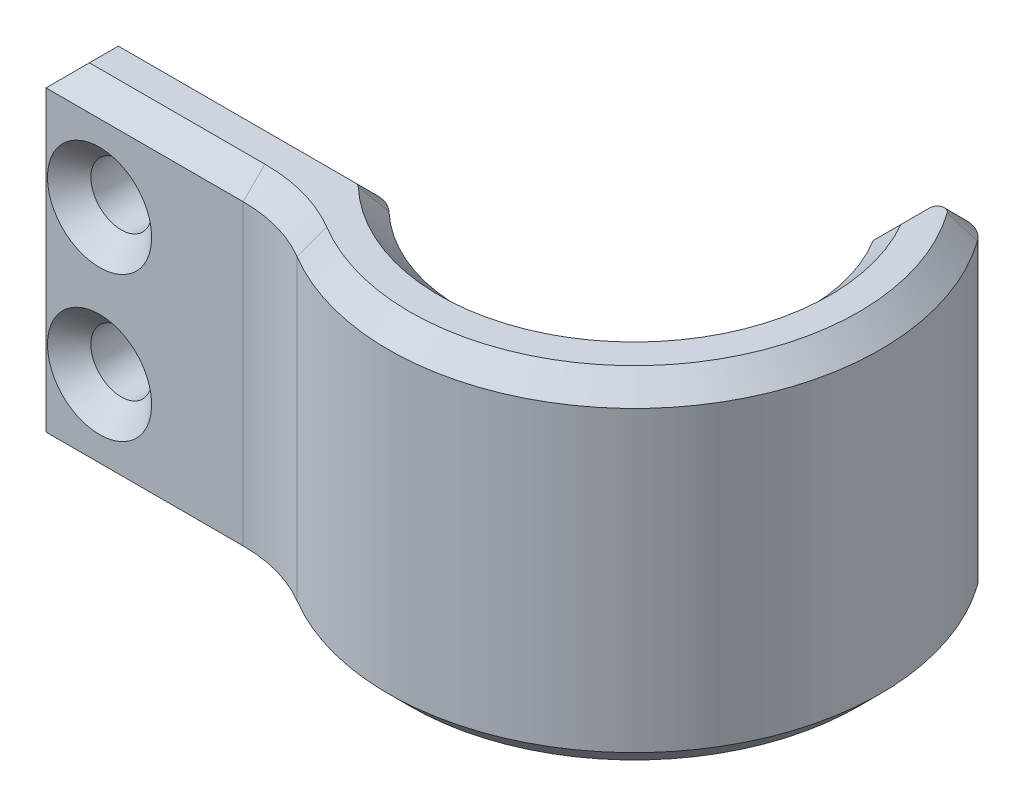
ISO-10303-21;
HEADER;
FILE_DESCRIPTION(('STEP AP214'),'2;1');
FILE_NAME('part.step','',(''),(''),'','','');
FILE_SCHEMA(('AUTOMOTIVE_DESIGN { 1 0 10303 214 1 1 1 1 }'));
ENDSEC;
DATA;
#1=APPLICATION_CONTEXT('core data for automotive mechanical design processes');
#2=APPLICATION_PROTOCOL_DEFINITION('international standard','automotive_design',2000,#1);
#3=PRODUCT_CONTEXT('',#1,'mechanical');
#4=PRODUCT('Part','Part','',(#3));
#5=PRODUCT_RELATED_PRODUCT_CATEGORY('part','',(#4));
#6=PRODUCT_DEFINITION_FORMATION('','',#4);
#7=PRODUCT_DEFINITION_CONTEXT('part definition',#1,'design');
#8=PRODUCT_DEFINITION('design','',#6,#7);
#9=PRODUCT_DEFINITION_SHAPE('','',#8);
#10=(LENGTH_UNIT() NAMED_UNIT(*) SI_UNIT(.MILLI.,.METRE.));
#11=(NAMED_UNIT(*) PLANE_ANGLE_UNIT() SI_UNIT($,.RADIAN.));
#12=(NAMED_UNIT(*) SI_UNIT($,.STERADIAN.) SOLID_ANGLE_UNIT());
#13=UNCERTAINTY_MEASURE_WITH_UNIT(LENGTH_MEASURE(1.E-05),#10,'distance_accuracy_value','');
#14=(GEOMETRIC_REPRESENTATION_CONTEXT(3) GLOBAL_UNCERTAINTY_ASSIGNED_CONTEXT((#13)) GLOBAL_UNIT_ASSIGNED_CONTEXT((#10,
#11,#12)) REPRESENTATION_CONTEXT('',''));
#15=CARTESIAN_POINT('',(0.,0.,0.));
#16=DIRECTION('',(0.,0.,1.));
#17=DIRECTION('',(1.,0.,0.));
#18=AXIS2_PLACEMENT_3D('',#15,#16,#17);
#19=CARTESIAN_POINT('',(0.,0.,5.));
#20=DIRECTION('',(0.,0.,-1.));
#21=DIRECTION('',(-1.,0.,0.));
#22=AXIS2_PLACEMENT_3D('',#19,#20,#21);
#23=PLANE('',#22);
#24=CARTESIAN_POINT('',(24.2500001282286,4.99999999999992,5.));
#25=DIRECTION('',(0.,0.,-1.));
#26=DIRECTION('',(-1.,0.,0.));
#27=AXIS2_PLACEMENT_3D('',#24,#25,#26);
#28=CIRCLE('',#27,3.60000000000001);
#29=CARTESIAN_POINT('',(20.6500001282286,4.99999999999992,5.));
#30=VERTEX_POINT('',#29);
#31=EDGE_CURVE('E47',#30,#30,#28,.T.);
#32=ORIENTED_EDGE('',*,*,#31,.T.);
#33=EDGE_LOOP('',(#32));
#34=FACE_BOUND('',#33,.T.);
#35=CARTESIAN_POINT('',(24.2500001282286,-4.99999999999988,5.));
#36=DIRECTION('',(0.,0.,-1.));
#37=DIRECTION('',(-1.,0.,0.));
#38=AXIS2_PLACEMENT_3D('',#35,#36,#37);
#39=CIRCLE('',#38,3.60000000000001);
#40=CARTESIAN_POINT('',(20.6500001282286,-4.99999999999988,5.));
#41=VERTEX_POINT('',#40);
#42=EDGE_CURVE('E414',#41,#41,#39,.T.);
#43=ORIENTED_EDGE('',*,*,#42,.T.);
#44=EDGE_LOOP('',(#43));
#45=FACE_BOUND('',#44,.T.);
#46=DIRECTION('',(0.,1.,0.));
#47=VECTOR('',#46,1.);
#48=CARTESIAN_POINT('',(34.1777436743295,0.,5.));
#49=LINE('',#48,#47);
#50=CARTESIAN_POINT('',(34.1777436743295,-10.3,5.));
#51=VERTEX_POINT('',#50);
#52=CARTESIAN_POINT('',(34.1777436743295,10.3,5.));
#53=VERTEX_POINT('',#52);
#54=EDGE_CURVE('E207',#51,#53,#49,.T.);
#55=ORIENTED_EDGE('',*,*,#54,.T.);
#56=DIRECTION('',(-1.,0.,0.));
#57=VECTOR('',#56,1.);
#58=CARTESIAN_POINT('',(0.,10.3,5.));
#59=LINE('',#58,#57);
#60=CARTESIAN_POINT('',(20.55,10.3,5.));
#61=VERTEX_POINT('',#60);
#62=EDGE_CURVE('E265',#53,#61,#59,.T.);
#63=ORIENTED_EDGE('',*,*,#62,.T.);
#64=DIRECTION('',(0.,-1.,0.));
#65=VECTOR('',#64,1.);
#66=CARTESIAN_POINT('',(20.55,-11.8,5.));
#67=LINE('',#66,#65);
#68=CARTESIAN_POINT('',(20.55,-10.3,5.));
#69=VERTEX_POINT('',#68);
#70=EDGE_CURVE('E450',#61,#69,#67,.T.);
#71=ORIENTED_EDGE('',*,*,#70,.T.);
#72=DIRECTION('',(1.,0.,0.));
#73=VECTOR('',#72,1.);
#74=CARTESIAN_POINT('',(0.,-10.3,5.));
#75=LINE('',#74,#73);
#76=EDGE_CURVE('E262',#69,#51,#75,.T.);
#77=ORIENTED_EDGE('',*,*,#76,.T.);
#78=EDGE_LOOP('',(#55,#63,#71,#77));
#79=FACE_BOUND('',#78,.T.);
#80=ADVANCED_FACE('F38',(#34,#45,#79),#23,.F.);
#81=CARTESIAN_POINT('',(0.,0.,0.));
#82=DIRECTION('',(0.,0.,-1.));
#83=DIRECTION('',(-1.,0.,0.));
#84=AXIS2_PLACEMENT_3D('',#81,#82,#83);
#85=PLANE('',#84);
#86=CARTESIAN_POINT('',(24.2500001282286,-4.99999999999988,0.));
#87=DIRECTION('',(0.,0.,1.));
#88=DIRECTION('',(1.,0.,0.));
#89=AXIS2_PLACEMENT_3D('',#86,#87,#88);
#90=CIRCLE('',#89,2.1);
#91=CARTESIAN_POINT('',(26.3500001282286,-4.99999999999988,0.));
#92=VERTEX_POINT('',#91);
#93=EDGE_CURVE('E438',#92,#92,#90,.T.);
#94=ORIENTED_EDGE('',*,*,#93,.T.);
#95=EDGE_LOOP('',(#94));
#96=FACE_BOUND('',#95,.T.);
#97=DIRECTION('',(0.,-1.,0.));
#98=VECTOR('',#97,1.);
#99=CARTESIAN_POINT('',(20.55,-11.8,0.));
#100=LINE('',#99,#98);
#101=CARTESIAN_POINT('',(20.55,10.3,0.));
#102=VERTEX_POINT('',#101);
#103=CARTESIAN_POINT('',(20.55,-10.3,0.));
#104=VERTEX_POINT('',#103);
#105=EDGE_CURVE('E444',#102,#104,#100,.T.);
#106=ORIENTED_EDGE('',*,*,#105,.F.);
#107=DIRECTION('',(1.,0.,0.));
#108=VECTOR('',#107,1.);
#109=CARTESIAN_POINT('',(38.4220374103553,10.3,0.));
#110=LINE('',#109,#108);
#111=CARTESIAN_POINT('',(38.4220374103553,10.3,0.));
#112=VERTEX_POINT('',#111);
#113=EDGE_CURVE('E278',#102,#112,#110,.T.);
#114=ORIENTED_EDGE('',*,*,#113,.T.);
#115=DIRECTION('',(0.,-1.,0.));
#116=VECTOR('',#115,1.);
#117=CARTESIAN_POINT('',(38.4220374103553,-11.8,0.));
#118=LINE('',#117,#116);
#119=CARTESIAN_POINT('',(38.4220374103553,-10.3,0.));
#120=VERTEX_POINT('',#119);
#121=EDGE_CURVE('E217',#112,#120,#118,.T.);
#122=ORIENTED_EDGE('',*,*,#121,.T.);
#123=DIRECTION('',(-1.,0.,0.));
#124=VECTOR('',#123,1.);
#125=CARTESIAN_POINT('',(20.55,-10.3,0.));
#126=LINE('',#125,#124);
#127=EDGE_CURVE('E275',#120,#104,#126,.T.);
#128=ORIENTED_EDGE('',*,*,#127,.T.);
#129=EDGE_LOOP('',(#106,#114,#122,#128));
#130=FACE_BOUND('',#129,.T.);
#131=CARTESIAN_POINT('',(24.2500001282286,4.99999999999992,0.));
#132=DIRECTION('',(0.,0.,1.));
#133=DIRECTION('',(1.,0.,0.));
#134=AXIS2_PLACEMENT_3D('',#131,#132,#133);
#135=CIRCLE('',#134,2.1);
#136=CARTESIAN_POINT('',(26.3500001282286,4.99999999999992,0.));
#137=VERTEX_POINT('',#136);
#138=EDGE_CURVE('E435',#137,#137,#135,.T.);
#139=ORIENTED_EDGE('',*,*,#138,.T.);
#140=EDGE_LOOP('',(#139));
#141=FACE_BOUND('',#140,.T.);
#142=ADVANCED_FACE('F466',(#96,#130,#141),#85,.T.);
#143=CARTESIAN_POINT('',(20.55,-11.8,5.));
#144=DIRECTION('',(1.,0.,0.));
#145=DIRECTION('',(0.,0.,-1.));
#146=AXIS2_PLACEMENT_3D('',#143,#144,#145);
#147=PLANE('',#146);
#148=ORIENTED_EDGE('',*,*,#70,.F.);
#149=DIRECTION('',(0.,0.,-1.));
#150=VECTOR('',#149,1.);
#151=CARTESIAN_POINT('',(20.55,10.3,5.));
#152=LINE('',#151,#150);
#153=EDGE_CURVE('E272',#61,#102,#152,.T.);
#154=ORIENTED_EDGE('',*,*,#153,.T.);
#155=ORIENTED_EDGE('',*,*,#105,.T.);
#156=DIRECTION('',(0.,0.,1.));
#157=VECTOR('',#156,1.);
#158=CARTESIAN_POINT('',(20.55,-10.3,5.));
#159=LINE('',#158,#157);
#160=EDGE_CURVE('E268',#104,#69,#159,.T.);
#161=ORIENTED_EDGE('',*,*,#160,.T.);
#162=EDGE_LOOP('',(#148,#154,#155,#161));
#163=FACE_BOUND('',#162,.T.);
#164=ADVANCED_FACE('F557',(#163),#147,.F.);
#165=CARTESIAN_POINT('',(20.55,-11.8,5.));
#166=DIRECTION('',(0.,1.,0.));
#167=DIRECTION('',(0.,0.,1.));
#168=AXIS2_PLACEMENT_3D('',#165,#166,#167);
#169=PLANE('',#168);
#170=DIRECTION('',(-1.,0.,0.));
#171=VECTOR('',#170,1.);
#172=CARTESIAN_POINT('',(20.55,-11.8,3.5));
#173=LINE('',#172,#171);
#174=CARTESIAN_POINT('',(34.1777436743295,-11.8,3.49999999999999));
#175=VERTEX_POINT('',#174);
#176=CARTESIAN_POINT('',(22.05,-11.8,3.5));
#177=VERTEX_POINT('',#176);
#178=EDGE_CURVE('E54',#175,#177,#173,.T.);
#179=ORIENTED_EDGE('',*,*,#178,.T.);
#180=DIRECTION('',(0.,0.,-1.));
#181=VECTOR('',#180,1.);
#182=CARTESIAN_POINT('',(22.05,-11.8,5.));
#183=LINE('',#182,#181);
#184=CARTESIAN_POINT('',(22.05,-11.8,1.5));
#185=VERTEX_POINT('',#184);
#186=EDGE_CURVE('E315',#177,#185,#183,.T.);
#187=ORIENTED_EDGE('',*,*,#186,.T.);
#188=DIRECTION('',(1.,0.,0.));
#189=VECTOR('',#188,1.);
#190=CARTESIAN_POINT('',(38.4220374103553,-11.8,1.5));
#191=LINE('',#190,#189);
#192=CARTESIAN_POINT('',(38.4220374103553,-11.8,1.5));
#193=VERTEX_POINT('',#192);
#194=EDGE_CURVE('E293',#185,#193,#191,.T.);
#195=ORIENTED_EDGE('',*,*,#194,.T.);
#196=CARTESIAN_POINT('',(38.4220374103553,-11.8,2.));
#197=DIRECTION('',(0.,1.,0.));
#198=DIRECTION('',(0.,0.,1.));
#199=AXIS2_PLACEMENT_3D('',#196,#197,#198);
#200=CIRCLE('',#199,0.5);
#201=CARTESIAN_POINT('',(38.7658932171283,-11.8,1.63700801090317));
#202=VERTEX_POINT('',#201);
#203=EDGE_CURVE('E296',#193,#202,#200,.F.);
#204=ORIENTED_EDGE('',*,*,#203,.T.);
#205=CARTESIAN_POINT('',(48.05,-11.8,-8.16377569471121));
#206=DIRECTION('',(0.,1.,0.));
#207=DIRECTION('',(0.,0.,1.));
#208=AXIS2_PLACEMENT_3D('',#205,#206,#207);
#209=CIRCLE('',#208,13.5);
#210=CARTESIAN_POINT('',(59.7684822882804,-11.8,-14.8665492146251));
#211=VERTEX_POINT('',#210);
#212=EDGE_CURVE('E299',#202,#211,#209,.T.);
#213=ORIENTED_EDGE('',*,*,#212,.T.);
#214=DIRECTION('',(0.,0.,-1.));
#215=VECTOR('',#214,1.);
#216=CARTESIAN_POINT('',(59.7684822882804,-11.8,-16.8648497991524));
#217=LINE('',#216,#215);
#218=CARTESIAN_POINT('',(59.7684822882804,-11.8,-16.8648497991524));
#219=VERTEX_POINT('',#218);
#220=EDGE_CURVE('E302',#211,#219,#217,.T.);
#221=ORIENTED_EDGE('',*,*,#220,.T.);
#222=CARTESIAN_POINT('',(60.2684822882804,-11.8,-16.8648497991524));
#223=DIRECTION('',(0.,1.,0.));
#224=DIRECTION('',(0.,0.,1.));
#225=AXIS2_PLACEMENT_3D('',#222,#223,#224);
#226=CIRCLE('',#225,0.5);
#227=CARTESIAN_POINT('',(60.6757650312231,-11.8,-17.1548856026338));
#228=VERTEX_POINT('',#227);
#229=EDGE_CURVE('E305',#219,#228,#226,.F.);
#230=ORIENTED_EDGE('',*,*,#229,.T.);
#231=CARTESIAN_POINT('',(48.05,-11.8,-8.16377569471121));
#232=DIRECTION('',(0.,1.,0.));
#233=DIRECTION('',(0.,0.,1.));
#234=AXIS2_PLACEMENT_3D('',#231,#232,#233);
#235=CIRCLE('',#234,15.5);
#236=CARTESIAN_POINT('',(40.0862972945225,-11.8,5.13394738928967));
#237=VERTEX_POINT('',#236);
#238=EDGE_CURVE('E308',#228,#237,#235,.F.);
#239=ORIENTED_EDGE('',*,*,#238,.T.);
#240=CARTESIAN_POINT('',(34.1777436743295,-11.8,15.));
#241=DIRECTION('',(0.,1.,0.));
#242=DIRECTION('',(0.,0.,1.));
#243=AXIS2_PLACEMENT_3D('',#240,#241,#242);
#244=CIRCLE('',#243,11.5);
#245=EDGE_CURVE('E59',#237,#175,#244,.T.);
#246=ORIENTED_EDGE('',*,*,#245,.T.);
#247=EDGE_LOOP('',(#179,#187,#195,#204,#213,#221,#230,#239,#246));
#248=FACE_BOUND('',#247,.T.);
#249=ADVANCED_FACE('F580',(#248),#169,.F.);
#250=CARTESIAN_POINT('',(20.55,11.8,5.));
#251=DIRECTION('',(0.,-1.,0.));
#252=DIRECTION('',(0.,0.,-1.));
#253=AXIS2_PLACEMENT_3D('',#250,#251,#252);
#254=PLANE('',#253);
#255=CARTESIAN_POINT('',(60.2684822882804,11.8,-16.8648497991524));
#256=DIRECTION('',(0.,-1.,0.));
#257=DIRECTION('',(0.,0.,-1.));
#258=AXIS2_PLACEMENT_3D('',#255,#256,#257);
#259=CIRCLE('',#258,0.499999999999987);
#260=CARTESIAN_POINT('',(60.6757650312231,11.8,-17.1548856026338));
#261=VERTEX_POINT('',#260);
#262=CARTESIAN_POINT('',(59.7684822882804,11.8,-16.8648497991524));
#263=VERTEX_POINT('',#262);
#264=EDGE_CURVE('E245',#261,#263,#259,.F.);
#265=ORIENTED_EDGE('',*,*,#264,.T.);
#266=DIRECTION('',(0.,0.,1.));
#267=VECTOR('',#266,1.);
#268=CARTESIAN_POINT('',(59.7684822882804,11.8,-14.4552476786033));
#269=LINE('',#268,#267);
#270=CARTESIAN_POINT('',(59.7684822882804,11.8,-14.866549214625));
#271=VERTEX_POINT('',#270);
#272=EDGE_CURVE('E171',#263,#271,#269,.T.);
#273=ORIENTED_EDGE('',*,*,#272,.T.);
#274=CARTESIAN_POINT('',(48.05,11.8,-8.16377569471121));
#275=DIRECTION('',(0.,-1.,0.));
#276=DIRECTION('',(0.,0.,-1.));
#277=AXIS2_PLACEMENT_3D('',#274,#275,#276);
#278=CIRCLE('',#277,13.5);
#279=CARTESIAN_POINT('',(38.7658932171283,11.8,1.63700801090318));
#280=VERTEX_POINT('',#279);
#281=EDGE_CURVE('E201',#271,#280,#278,.T.);
#282=ORIENTED_EDGE('',*,*,#281,.T.);
#283=CARTESIAN_POINT('',(38.4220374103553,11.8,2.));
#284=DIRECTION('',(0.,-1.,0.));
#285=DIRECTION('',(0.,0.,-1.));
#286=AXIS2_PLACEMENT_3D('',#283,#284,#285);
#287=CIRCLE('',#286,0.49999999999999);
#288=CARTESIAN_POINT('',(38.4220374103553,11.8,1.50000000000001));
#289=VERTEX_POINT('',#288);
#290=EDGE_CURVE('E228',#280,#289,#287,.F.);
#291=ORIENTED_EDGE('',*,*,#290,.T.);
#292=DIRECTION('',(-1.,0.,0.));
#293=VECTOR('',#292,1.);
#294=CARTESIAN_POINT('',(20.55,11.8,1.50000000000001));
#295=LINE('',#294,#293);
#296=CARTESIAN_POINT('',(22.05,11.8,1.50000000000001));
#297=VERTEX_POINT('',#296);
#298=EDGE_CURVE('E231',#289,#297,#295,.T.);
#299=ORIENTED_EDGE('',*,*,#298,.T.);
#300=DIRECTION('',(0.,0.,1.));
#301=VECTOR('',#300,1.);
#302=CARTESIAN_POINT('',(22.05,11.8,5.));
#303=LINE('',#302,#301);
#304=CARTESIAN_POINT('',(22.05,11.8,3.49999999999999));
#305=VERTEX_POINT('',#304);
#306=EDGE_CURVE('E234',#297,#305,#303,.T.);
#307=ORIENTED_EDGE('',*,*,#306,.T.);
#308=DIRECTION('',(1.,0.,0.));
#309=VECTOR('',#308,1.);
#310=CARTESIAN_POINT('',(20.55,11.8,3.49999999999999));
#311=LINE('',#310,#309);
#312=CARTESIAN_POINT('',(34.1777436743295,11.8,3.49999999999999));
#313=VERTEX_POINT('',#312);
#314=EDGE_CURVE('E236',#305,#313,#311,.T.);
#315=ORIENTED_EDGE('',*,*,#314,.T.);
#316=CARTESIAN_POINT('',(34.1777436743295,11.8,15.));
#317=DIRECTION('',(0.,-1.,0.));
#318=DIRECTION('',(0.,0.,-1.));
#319=AXIS2_PLACEMENT_3D('',#316,#317,#318);
#320=CIRCLE('',#319,11.5);
#321=CARTESIAN_POINT('',(40.0862972945225,11.8,5.13394738928966));
#322=VERTEX_POINT('',#321);
#323=EDGE_CURVE('E239',#313,#322,#320,.T.);
#324=ORIENTED_EDGE('',*,*,#323,.T.);
#325=CARTESIAN_POINT('',(48.05,11.8,-8.16377569471121));
#326=DIRECTION('',(0.,-1.,0.));
#327=DIRECTION('',(0.,0.,-1.));
#328=AXIS2_PLACEMENT_3D('',#325,#326,#327);
#329=CIRCLE('',#328,15.5);
#330=EDGE_CURVE('E242',#322,#261,#329,.F.);
#331=ORIENTED_EDGE('',*,*,#330,.T.);
#332=EDGE_LOOP('',(#265,#273,#282,#291,#299,#307,#315,#324,#331));
#333=FACE_BOUND('',#332,.T.);
#334=ADVANCED_FACE('F526',(#333),#254,.F.);
#335=CARTESIAN_POINT('',(24.2500001282286,-4.99999999999988,5.));
#336=DIRECTION('',(0.,0.,-1.));
#337=DIRECTION('',(-1.,0.,0.));
#338=AXIS2_PLACEMENT_3D('',#335,#336,#337);
#339=CYLINDRICAL_SURFACE('',#338,2.1);
#340=CARTESIAN_POINT('',(24.2500001282286,-4.99999999999988,3.49999999999999));
#341=DIRECTION('',(0.,0.,-1.));
#342=DIRECTION('',(-1.,0.,0.));
#343=AXIS2_PLACEMENT_3D('',#340,#341,#342);
#344=CIRCLE('',#343,2.1);
#345=CARTESIAN_POINT('',(22.1500001282286,-4.99999999999988,3.49999999999999));
#346=VERTEX_POINT('',#345);
#347=EDGE_CURVE('E11',#346,#346,#344,.F.);
#348=ORIENTED_EDGE('',*,*,#347,.T.);
#349=EDGE_LOOP('',(#348));
#350=FACE_BOUND('',#349,.T.);
#351=ORIENTED_EDGE('',*,*,#93,.F.);
#352=EDGE_LOOP('',(#351));
#353=FACE_BOUND('',#352,.T.);
#354=ADVANCED_FACE('F431',(#350,#353),#339,.F.);
#355=CARTESIAN_POINT('',(24.2500001282286,4.99999999999992,5.));
#356=DIRECTION('',(0.,0.,-1.));
#357=DIRECTION('',(-1.,0.,0.));
#358=AXIS2_PLACEMENT_3D('',#355,#356,#357);
#359=CYLINDRICAL_SURFACE('',#358,2.1);
#360=CARTESIAN_POINT('',(24.2500001282286,4.99999999999992,3.49999999999999));
#361=DIRECTION('',(0.,0.,-1.));
#362=DIRECTION('',(-1.,0.,0.));
#363=AXIS2_PLACEMENT_3D('',#360,#361,#362);
#364=CIRCLE('',#363,2.1);
#365=CARTESIAN_POINT('',(22.1500001282286,4.99999999999992,3.49999999999999));
#366=VERTEX_POINT('',#365);
#367=EDGE_CURVE('E317',#366,#366,#364,.F.);
#368=ORIENTED_EDGE('',*,*,#367,.T.);
#369=EDGE_LOOP('',(#368));
#370=FACE_BOUND('',#369,.T.);
#371=ORIENTED_EDGE('',*,*,#138,.F.);
#372=EDGE_LOOP('',(#371));
#373=FACE_BOUND('',#372,.T.);
#374=ADVANCED_FACE('F427',(#370,#373),#359,.F.);
#375=CARTESIAN_POINT('',(48.05,-53.9486732117876,-8.16377569471121));
#376=DIRECTION('',(0.,1.,0.));
#377=DIRECTION('',(0.,0.,1.));
#378=AXIS2_PLACEMENT_3D('',#375,#376,#377);
#379=CYLINDRICAL_SURFACE('',#378,17.);
#380=DIRECTION('',(0.,1.,0.));
#381=VECTOR('',#380,1.);
#382=CARTESIAN_POINT('',(61.8976132600511,-53.9486732117876,-18.0249930130779));
#383=LINE('',#382,#381);
#384=CARTESIAN_POINT('',(61.8976132600511,-10.3,-18.0249930130779));
#385=VERTEX_POINT('',#384);
#386=CARTESIAN_POINT('',(61.8976132600511,10.3,-18.0249930130779));
#387=VERTEX_POINT('',#386);
#388=EDGE_CURVE('E208',#385,#387,#383,.T.);
#389=ORIENTED_EDGE('',*,*,#388,.T.);
#390=CARTESIAN_POINT('',(48.05,10.3,-8.16377569471121));
#391=DIRECTION('',(0.,-1.,0.));
#392=DIRECTION('',(0.,0.,-1.));
#393=AXIS2_PLACEMENT_3D('',#390,#391,#392);
#394=CIRCLE('',#393,17.);
#395=CARTESIAN_POINT('',(39.3156163875408,10.3,6.42082381677363));
#396=VERTEX_POINT('',#395);
#397=EDGE_CURVE('E254',#387,#396,#394,.T.);
#398=ORIENTED_EDGE('',*,*,#397,.T.);
#399=DIRECTION('',(0.,1.,0.));
#400=VECTOR('',#399,1.);
#401=CARTESIAN_POINT('',(39.3156163875408,-53.9486732117876,6.42082381677363));
#402=LINE('',#401,#400);
#403=CARTESIAN_POINT('',(39.3156163875408,-10.3,6.42082381677363));
#404=VERTEX_POINT('',#403);
#405=EDGE_CURVE('E214',#396,#404,#402,.F.);
#406=ORIENTED_EDGE('',*,*,#405,.T.);
#407=CARTESIAN_POINT('',(48.05,-10.3,-8.16377569471121));
#408=DIRECTION('',(0.,1.,0.));
#409=DIRECTION('',(0.,0.,1.));
#410=AXIS2_PLACEMENT_3D('',#407,#408,#409);
#411=CIRCLE('',#410,17.);
#412=EDGE_CURVE('E188',#404,#385,#411,.T.);
#413=ORIENTED_EDGE('',*,*,#412,.T.);
#414=EDGE_LOOP('',(#389,#398,#406,#413));
#415=FACE_BOUND('',#414,.T.);
#416=ADVANCED_FACE('F430',(#415),#379,.T.);
#417=CARTESIAN_POINT('',(58.2684822882804,-53.9486732117876,0.));
#418=DIRECTION('',(-1.,0.,0.));
#419=DIRECTION('',(0.,0.,1.));
#420=AXIS2_PLACEMENT_3D('',#417,#418,#419);
#421=PLANE('',#420);
#422=DIRECTION('',(0.,1.,0.));
#423=VECTOR('',#422,1.);
#424=CARTESIAN_POINT('',(58.2684822882804,-53.9486732117876,-14.4552476786033));
#425=LINE('',#424,#423);
#426=CARTESIAN_POINT('',(58.2684822882804,-10.3,-14.4552476786033));
#427=VERTEX_POINT('',#426);
#428=CARTESIAN_POINT('',(58.2684822882804,10.3,-14.4552476786033));
#429=VERTEX_POINT('',#428);
#430=EDGE_CURVE('E198',#427,#429,#425,.T.);
#431=ORIENTED_EDGE('',*,*,#430,.T.);
#432=DIRECTION('',(0.,0.,-1.));
#433=VECTOR('',#432,1.);
#434=CARTESIAN_POINT('',(58.2684822882804,10.3,-16.8648497991524));
#435=LINE('',#434,#433);
#436=CARTESIAN_POINT('',(58.2684822882804,10.3,-16.8648497991524));
#437=VERTEX_POINT('',#436);
#438=EDGE_CURVE('E169',#429,#437,#435,.T.);
#439=ORIENTED_EDGE('',*,*,#438,.T.);
#440=DIRECTION('',(0.,1.,0.));
#441=VECTOR('',#440,1.);
#442=CARTESIAN_POINT('',(58.2684822882804,-53.9486732117876,-16.8648497991524));
#443=LINE('',#442,#441);
#444=CARTESIAN_POINT('',(58.2684822882804,-10.3,-16.8648497991524));
#445=VERTEX_POINT('',#444);
#446=EDGE_CURVE('E195',#437,#445,#443,.F.);
#447=ORIENTED_EDGE('',*,*,#446,.T.);
#448=DIRECTION('',(0.,0.,1.));
#449=VECTOR('',#448,1.);
#450=CARTESIAN_POINT('',(58.2684822882804,-10.3,-14.4552476786033));
#451=LINE('',#450,#449);
#452=EDGE_CURVE('E202',#445,#427,#451,.T.);
#453=ORIENTED_EDGE('',*,*,#452,.T.);
#454=EDGE_LOOP('',(#431,#439,#447,#453));
#455=FACE_BOUND('',#454,.T.);
#456=ADVANCED_FACE('F194',(#455),#421,.T.);
#457=CARTESIAN_POINT('',(48.05,-53.9486732117876,-8.16377569471121));
#458=DIRECTION('',(0.,1.,0.));
#459=DIRECTION('',(0.,0.,1.));
#460=AXIS2_PLACEMENT_3D('',#457,#458,#459);
#461=CYLINDRICAL_SURFACE('',#460,12.);
#462=DIRECTION('',(0.,1.,0.));
#463=VECTOR('',#462,1.);
#464=CARTESIAN_POINT('',(39.7974606374474,-53.9486732117876,0.548032043612685));
#465=LINE('',#464,#463);
#466=CARTESIAN_POINT('',(39.7974606374474,-10.3,0.548032043612685));
#467=VERTEX_POINT('',#466);
#468=CARTESIAN_POINT('',(39.7974606374474,10.3,0.548032043612685));
#469=VERTEX_POINT('',#468);
#470=EDGE_CURVE('E454',#467,#469,#465,.T.);
#471=ORIENTED_EDGE('',*,*,#470,.T.);
#472=CARTESIAN_POINT('',(48.05,10.3,-8.16377569471121));
#473=DIRECTION('',(0.,-1.,0.));
#474=DIRECTION('',(0.,0.,-1.));
#475=AXIS2_PLACEMENT_3D('',#472,#473,#474);
#476=CIRCLE('',#475,12.);
#477=EDGE_CURVE('E290',#469,#429,#476,.F.);
#478=ORIENTED_EDGE('',*,*,#477,.T.);
#479=ORIENTED_EDGE('',*,*,#430,.F.);
#480=CARTESIAN_POINT('',(48.05,-10.3,-8.16377569471121));
#481=DIRECTION('',(0.,1.,0.));
#482=DIRECTION('',(0.,0.,1.));
#483=AXIS2_PLACEMENT_3D('',#480,#481,#482);
#484=CIRCLE('',#483,12.);
#485=EDGE_CURVE('E287',#427,#467,#484,.F.);
#486=ORIENTED_EDGE('',*,*,#485,.T.);
#487=EDGE_LOOP('',(#471,#478,#479,#486));
#488=FACE_BOUND('',#487,.T.);
#489=ADVANCED_FACE('F516',(#488),#461,.F.);
#490=CARTESIAN_POINT('',(38.4220374103553,-53.9486732117876,2.));
#491=DIRECTION('',(0.,1.,0.));
#492=DIRECTION('',(0.,0.,1.));
#493=AXIS2_PLACEMENT_3D('',#490,#491,#492);
#494=CYLINDRICAL_SURFACE('',#493,2.);
#495=ORIENTED_EDGE('',*,*,#121,.F.);
#496=CARTESIAN_POINT('',(38.4220374103553,10.3,2.));
#497=DIRECTION('',(0.,-1.,0.));
#498=DIRECTION('',(0.,0.,-1.));
#499=AXIS2_PLACEMENT_3D('',#496,#497,#498);
#500=CIRCLE('',#499,2.);
#501=EDGE_CURVE('E284',#112,#469,#500,.T.);
#502=ORIENTED_EDGE('',*,*,#501,.T.);
#503=ORIENTED_EDGE('',*,*,#470,.F.);
#504=CARTESIAN_POINT('',(38.4220374103553,-10.3,2.));
#505=DIRECTION('',(0.,1.,0.));
#506=DIRECTION('',(0.,0.,1.));
#507=AXIS2_PLACEMENT_3D('',#504,#505,#506);
#508=CIRCLE('',#507,2.);
#509=EDGE_CURVE('E281',#467,#120,#508,.T.);
#510=ORIENTED_EDGE('',*,*,#509,.T.);
#511=EDGE_LOOP('',(#495,#502,#503,#510));
#512=FACE_BOUND('',#511,.T.);
#513=ADVANCED_FACE('F567',(#512),#494,.T.);
#514=CARTESIAN_POINT('',(60.2684822882804,-53.9486732117876,-16.8648497991524));
#515=DIRECTION('',(0.,1.,0.));
#516=DIRECTION('',(0.,0.,1.));
#517=AXIS2_PLACEMENT_3D('',#514,#515,#516);
#518=CYLINDRICAL_SURFACE('',#517,2.);
#519=ORIENTED_EDGE('',*,*,#446,.F.);
#520=CARTESIAN_POINT('',(60.2684822882804,10.3,-16.8648497991524));
#521=DIRECTION('',(0.,-1.,0.));
#522=DIRECTION('',(0.,0.,-1.));
#523=AXIS2_PLACEMENT_3D('',#520,#521,#522);
#524=CIRCLE('',#523,2.);
#525=EDGE_CURVE('E179',#437,#387,#524,.T.);
#526=ORIENTED_EDGE('',*,*,#525,.T.);
#527=ORIENTED_EDGE('',*,*,#388,.F.);
#528=CARTESIAN_POINT('',(60.2684822882804,-10.3,-16.8648497991524));
#529=DIRECTION('',(0.,1.,0.));
#530=DIRECTION('',(0.,0.,1.));
#531=AXIS2_PLACEMENT_3D('',#528,#529,#530);
#532=CIRCLE('',#531,2.);
#533=EDGE_CURVE('E189',#385,#445,#532,.T.);
#534=ORIENTED_EDGE('',*,*,#533,.T.);
#535=EDGE_LOOP('',(#519,#526,#527,#534));
#536=FACE_BOUND('',#535,.T.);
#537=ADVANCED_FACE('F204',(#536),#518,.T.);
#538=CARTESIAN_POINT('',(34.1777436743295,-53.9486732117876,15.));
#539=DIRECTION('',(0.,1.,0.));
#540=DIRECTION('',(0.,0.,1.));
#541=AXIS2_PLACEMENT_3D('',#538,#539,#540);
#542=CYLINDRICAL_SURFACE('',#541,10.);
#543=ORIENTED_EDGE('',*,*,#405,.F.);
#544=CARTESIAN_POINT('',(34.1777436743295,10.3,15.));
#545=DIRECTION('',(0.,-1.,0.));
#546=DIRECTION('',(0.,0.,-1.));
#547=AXIS2_PLACEMENT_3D('',#544,#545,#546);
#548=CIRCLE('',#547,10.);
#549=EDGE_CURVE('E259',#396,#53,#548,.F.);
#550=ORIENTED_EDGE('',*,*,#549,.T.);
#551=ORIENTED_EDGE('',*,*,#54,.F.);
#552=CARTESIAN_POINT('',(34.1777436743295,-10.3,15.));
#553=DIRECTION('',(0.,1.,0.));
#554=DIRECTION('',(0.,0.,1.));
#555=AXIS2_PLACEMENT_3D('',#552,#553,#554);
#556=CIRCLE('',#555,10.);
#557=EDGE_CURVE('E257',#51,#404,#556,.F.);
#558=ORIENTED_EDGE('',*,*,#557,.T.);
#559=EDGE_LOOP('',(#543,#550,#551,#558));
#560=FACE_BOUND('',#559,.T.);
#561=ADVANCED_FACE('F360',(#560),#542,.F.);
#562=CARTESIAN_POINT('',(20.55,10.3,5.));
#563=DIRECTION('',(0.707106781186547,-0.707106781186547,0.));
#564=DIRECTION('',(0.,0.,-1.));
#565=AXIS2_PLACEMENT_3D('',#562,#563,#564);
#566=PLANE('',#565);
#567=DIRECTION('',(-0.577350269189626,-0.577350269189626,-0.577350269189626));
#568=VECTOR('',#567,1.);
#569=CARTESIAN_POINT('',(21.55,11.3,1.00000000000001));
#570=LINE('',#569,#568);
#571=EDGE_CURVE('E542',#102,#297,#570,.F.);
#572=ORIENTED_EDGE('',*,*,#571,.F.);
#573=ORIENTED_EDGE('',*,*,#153,.F.);
#574=DIRECTION('',(0.577350269189626,0.577350269189626,-0.577350269189626));
#575=VECTOR('',#574,1.);
#576=CARTESIAN_POINT('',(20.55,10.3,5.));
#577=LINE('',#576,#575);
#578=EDGE_CURVE('E447',#305,#61,#577,.F.);
#579=ORIENTED_EDGE('',*,*,#578,.F.);
#580=ORIENTED_EDGE('',*,*,#306,.F.);
#581=EDGE_LOOP('',(#572,#573,#579,#580));
#582=FACE_BOUND('',#581,.T.);
#583=ADVANCED_FACE('F356',(#582),#566,.F.);
#584=CARTESIAN_POINT('',(0.,10.3,5.));
#585=DIRECTION('',(0.,-0.707106781186547,-0.707106781186547));
#586=DIRECTION('',(-1.,0.,0.));
#587=AXIS2_PLACEMENT_3D('',#584,#585,#586);
#588=PLANE('',#587);
#589=ORIENTED_EDGE('',*,*,#578,.T.);
#590=ORIENTED_EDGE('',*,*,#62,.F.);
#591=DIRECTION('',(0.,-0.707106781186547,0.707106781186547));
#592=VECTOR('',#591,1.);
#593=CARTESIAN_POINT('',(34.1777436743295,11.8,3.49999999999999));
#594=LINE('',#593,#592);
#595=EDGE_CURVE('E540',#313,#53,#594,.T.);
#596=ORIENTED_EDGE('',*,*,#595,.F.);
#597=ORIENTED_EDGE('',*,*,#314,.F.);
#598=EDGE_LOOP('',(#589,#590,#596,#597));
#599=FACE_BOUND('',#598,.T.);
#600=ADVANCED_FACE('F352',(#599),#588,.F.);
#601=CARTESIAN_POINT('',(20.55,11.8,1.50000000000001));
#602=DIRECTION('',(0.,0.707106781186547,-0.707106781186547));
#603=DIRECTION('',(1.,0.,0.));
#604=AXIS2_PLACEMENT_3D('',#601,#602,#603);
#605=PLANE('',#604);
#606=ORIENTED_EDGE('',*,*,#571,.T.);
#607=ORIENTED_EDGE('',*,*,#298,.F.);
#608=DIRECTION('',(0.,0.707106781186547,0.707106781186547));
#609=VECTOR('',#608,1.);
#610=CARTESIAN_POINT('',(38.4220374103553,10.3,0.));
#611=LINE('',#610,#609);
#612=EDGE_CURVE('E535',#112,#289,#611,.T.);
#613=ORIENTED_EDGE('',*,*,#612,.F.);
#614=ORIENTED_EDGE('',*,*,#113,.F.);
#615=EDGE_LOOP('',(#606,#607,#613,#614));
#616=FACE_BOUND('',#615,.T.);
#617=ADVANCED_FACE('F348',(#616),#605,.T.);
#618=CARTESIAN_POINT('',(34.1777436743295,11.8,15.));
#619=DIRECTION('',(0.,1.,0.));
#620=DIRECTION('',(0.,0.,1.));
#621=AXIS2_PLACEMENT_3D('',#618,#619,#620);
#622=CONICAL_SURFACE('',#621,11.5,0.785398163397447);
#623=ORIENTED_EDGE('',*,*,#595,.T.);
#624=ORIENTED_EDGE('',*,*,#549,.F.);
#625=DIRECTION('',(-0.363302463638503,-0.707106781186548,0.606639365615349));
#626=VECTOR('',#625,1.);
#627=CARTESIAN_POINT('',(40.0862972945225,11.8,5.13394738928966));
#628=LINE('',#627,#626);
#629=EDGE_CURVE('E533',#322,#396,#628,.T.);
#630=ORIENTED_EDGE('',*,*,#629,.F.);
#631=ORIENTED_EDGE('',*,*,#323,.F.);
#632=EDGE_LOOP('',(#623,#624,#630,#631));
#633=FACE_BOUND('',#632,.T.);
#634=ADVANCED_FACE('F344',(#633),#622,.F.);
#635=CARTESIAN_POINT('',(38.4220374103553,11.8,2.));
#636=DIRECTION('',(0.,-1.,0.));
#637=DIRECTION('',(0.,0.,-1.));
#638=AXIS2_PLACEMENT_3D('',#635,#636,#637);
#639=CONICAL_SURFACE('',#638,0.499999999999988,0.785398163397447);
#640=ORIENTED_EDGE('',*,*,#612,.T.);
#641=ORIENTED_EDGE('',*,*,#290,.F.);
#642=DIRECTION('',(-0.486285545439154,0.707106781186548,0.513348194013521));
#643=VECTOR('',#642,1.);
#644=CARTESIAN_POINT('',(39.7974606374474,10.3,0.548032043612687));
#645=LINE('',#644,#643);
#646=EDGE_CURVE('E523',#469,#280,#645,.T.);
#647=ORIENTED_EDGE('',*,*,#646,.F.);
#648=ORIENTED_EDGE('',*,*,#501,.F.);
#649=EDGE_LOOP('',(#640,#641,#647,#648));
#650=FACE_BOUND('',#649,.T.);
#651=ADVANCED_FACE('F340',(#650),#639,.T.);
#652=CARTESIAN_POINT('',(48.05,10.3,-8.16377569471121));
#653=DIRECTION('',(0.,-1.,0.));
#654=DIRECTION('',(0.,0.,-1.));
#655=AXIS2_PLACEMENT_3D('',#652,#653,#654);
#656=CONICAL_SURFACE('',#655,17.,0.785398163397447);
#657=ORIENTED_EDGE('',*,*,#629,.T.);
#658=ORIENTED_EDGE('',*,*,#397,.F.);
#659=DIRECTION('',(0.575984778790051,-0.707106781186549,-0.410172566857137));
#660=VECTOR('',#659,1.);
#661=CARTESIAN_POINT('',(60.6757650312231,11.8,-17.1548856026338));
#662=LINE('',#661,#660);
#663=EDGE_CURVE('E182',#261,#387,#662,.T.);
#664=ORIENTED_EDGE('',*,*,#663,.F.);
#665=ORIENTED_EDGE('',*,*,#330,.F.);
#666=EDGE_LOOP('',(#657,#658,#664,#665));
#667=FACE_BOUND('',#666,.T.);
#668=ADVANCED_FACE('F337',(#667),#656,.T.);
#669=CARTESIAN_POINT('',(48.05,11.8,-8.16377569471121));
#670=DIRECTION('',(0.,1.,0.));
#671=DIRECTION('',(0.,0.,1.));
#672=AXIS2_PLACEMENT_3D('',#669,#670,#671);
#673=CONICAL_SURFACE('',#672,13.5,0.785398163397447);
#674=ORIENTED_EDGE('',*,*,#646,.T.);
#675=ORIENTED_EDGE('',*,*,#281,.F.);
#676=CARTESIAN_POINT('',(59.7684822882804,11.8,-14.866549214625));
#677=CARTESIAN_POINT('',(59.5181957819663,11.5497134936858,-14.8000896857818));
#678=CARTESIAN_POINT('',(59.2680525930418,11.2995703047613,-14.732584811529));
#679=CARTESIAN_POINT('',(58.7680525927469,10.7995703044664,-14.5954843016729));
#680=CARTESIAN_POINT('',(58.5181957816713,10.5497134933909,-14.5258886639184));
#681=CARTESIAN_POINT('',(58.2684822882804,10.3,-14.4552476786033));
#682=B_SPLINE_CURVE_WITH_KNOTS('',3,(#676,#677,#678,#679,#680,#681),.UNSPECIFIED.,.F.,.F.,(4,2,
4),(0.,1.08041716101072,2.1608354336649),.UNSPECIFIED.);
#683=EDGE_CURVE('E175',#429,#271,#682,.F.);
#684=ORIENTED_EDGE('',*,*,#683,.F.);
#685=ORIENTED_EDGE('',*,*,#477,.F.);
#686=EDGE_LOOP('',(#674,#675,#684,#685));
#687=FACE_BOUND('',#686,.T.);
#688=ADVANCED_FACE('F328',(#687),#673,.F.);
#689=CARTESIAN_POINT('',(60.2684822882804,11.8,-16.8648497991524));
#690=DIRECTION('',(0.,-1.,0.));
#691=DIRECTION('',(0.,0.,-1.));
#692=AXIS2_PLACEMENT_3D('',#689,#690,#691);
#693=CONICAL_SURFACE('',#692,0.499999999999987,0.785398163397448);
#694=ORIENTED_EDGE('',*,*,#663,.T.);
#695=ORIENTED_EDGE('',*,*,#525,.F.);
#696=DIRECTION('',(-0.707106781186548,-0.707106781186547,0.));
#697=VECTOR('',#696,1.);
#698=CARTESIAN_POINT('',(59.7684822882804,11.8,-16.8648497991524));
#699=LINE('',#698,#697);
#700=EDGE_CURVE('E165',#263,#437,#699,.T.);
#701=ORIENTED_EDGE('',*,*,#700,.F.);
#702=ORIENTED_EDGE('',*,*,#264,.F.);
#703=EDGE_LOOP('',(#694,#695,#701,#702));
#704=FACE_BOUND('',#703,.T.);
#705=ADVANCED_FACE('F180',(#704),#693,.T.);
#706=CARTESIAN_POINT('',(58.2684822882804,10.3,0.));
#707=DIRECTION('',(-0.707106781186546,0.70710678118655,0.));
#708=DIRECTION('',(0.,0.,1.));
#709=AXIS2_PLACEMENT_3D('',#706,#707,#708);
#710=PLANE('',#709);
#711=ORIENTED_EDGE('',*,*,#683,.T.);
#712=ORIENTED_EDGE('',*,*,#272,.F.);
#713=ORIENTED_EDGE('',*,*,#700,.T.);
#714=ORIENTED_EDGE('',*,*,#438,.F.);
#715=EDGE_LOOP('',(#711,#712,#713,#714));
#716=FACE_BOUND('',#715,.T.);
#717=ADVANCED_FACE('F167',(#716),#710,.T.);
#718=CARTESIAN_POINT('',(60.2684822882804,-11.8,-16.8648497991524));
#719=DIRECTION('',(0.,1.,0.));
#720=DIRECTION('',(0.,0.,1.));
#721=AXIS2_PLACEMENT_3D('',#718,#719,#720);
#722=CONICAL_SURFACE('',#721,0.500000000000002,0.785398163397445);
#723=DIRECTION('',(0.575984778790053,0.70710678118655,-0.410172566857134));
#724=VECTOR('',#723,1.);
#725=CARTESIAN_POINT('',(60.6757650312231,-11.8,-17.1548856026338));
#726=LINE('',#725,#724);
#727=EDGE_CURVE('E402',#228,#385,#726,.T.);
#728=ORIENTED_EDGE('',*,*,#727,.F.);
#729=ORIENTED_EDGE('',*,*,#229,.F.);
#730=DIRECTION('',(0.707106781186545,-0.70710678118655,0.));
#731=VECTOR('',#730,1.);
#732=CARTESIAN_POINT('',(58.2684822882804,-10.3,-16.8648497991524));
#733=LINE('',#732,#731);
#734=EDGE_CURVE('E176',#445,#219,#733,.T.);
#735=ORIENTED_EDGE('',*,*,#734,.F.);
#736=ORIENTED_EDGE('',*,*,#533,.F.);
#737=EDGE_LOOP('',(#728,#729,#735,#736));
#738=FACE_BOUND('',#737,.T.);
#739=ADVANCED_FACE('F334',(#738),#722,.T.);
#740=CARTESIAN_POINT('',(59.7684822882804,-11.8,5.));
#741=DIRECTION('',(-0.707106781186548,-0.707106781186547,0.));
#742=DIRECTION('',(0.,0.,1.));
#743=AXIS2_PLACEMENT_3D('',#740,#741,#742);
#744=PLANE('',#743);
#745=ORIENTED_EDGE('',*,*,#734,.T.);
#746=ORIENTED_EDGE('',*,*,#220,.F.);
#747=CARTESIAN_POINT('',(58.2684822882804,-10.3,-14.4552476786033));
#748=CARTESIAN_POINT('',(58.5181957816713,-10.5497134933909,-14.5258886639184));
#749=CARTESIAN_POINT('',(58.7680525927469,-10.7995703044664,-14.5954843016729));
#750=CARTESIAN_POINT('',(59.2680525930418,-11.2995703047613,-14.732584811529));
#751=CARTESIAN_POINT('',(59.5181957819662,-11.5497134936858,-14.8000896857818));
#752=CARTESIAN_POINT('',(59.7684822882804,-11.8,-14.8665492146251));
#753=B_SPLINE_CURVE_WITH_KNOTS('',3,(#747,#748,#749,#750,#751,#752),.UNSPECIFIED.,.F.,.F.,(4,2,
4),(0.,1.08041827265418,2.16083543366489),.UNSPECIFIED.);
#754=EDGE_CURVE('E393',#427,#211,#753,.T.);
#755=ORIENTED_EDGE('',*,*,#754,.F.);
#756=ORIENTED_EDGE('',*,*,#452,.F.);
#757=EDGE_LOOP('',(#745,#746,#755,#756));
#758=FACE_BOUND('',#757,.T.);
#759=ADVANCED_FACE('F389',(#758),#744,.T.);
#760=CARTESIAN_POINT('',(48.05,-11.8,-8.16377569471121));
#761=DIRECTION('',(0.,1.,0.));
#762=DIRECTION('',(0.,0.,1.));
#763=AXIS2_PLACEMENT_3D('',#760,#761,#762);
#764=CONICAL_SURFACE('',#763,15.5,0.785398163397446);
#765=ORIENTED_EDGE('',*,*,#727,.T.);
#766=ORIENTED_EDGE('',*,*,#412,.F.);
#767=DIRECTION('',(-0.363302463638505,0.707106781186549,0.606639365615347));
#768=VECTOR('',#767,1.);
#769=CARTESIAN_POINT('',(40.0862972945225,-11.8,5.13394738928967));
#770=LINE('',#769,#768);
#771=EDGE_CURVE('E403',#237,#404,#770,.T.);
#772=ORIENTED_EDGE('',*,*,#771,.F.);
#773=ORIENTED_EDGE('',*,*,#238,.F.);
#774=EDGE_LOOP('',(#765,#766,#772,#773));
#775=FACE_BOUND('',#774,.T.);
#776=ADVANCED_FACE('F387',(#775),#764,.T.);
#777=CARTESIAN_POINT('',(48.05,-10.3,-8.16377569471121));
#778=DIRECTION('',(0.,-1.,0.));
#779=DIRECTION('',(0.,0.,-1.));
#780=AXIS2_PLACEMENT_3D('',#777,#778,#779);
#781=CONICAL_SURFACE('',#780,12.,0.785398163397446);
#782=ORIENTED_EDGE('',*,*,#754,.T.);
#783=ORIENTED_EDGE('',*,*,#212,.F.);
#784=DIRECTION('',(-0.486285545439153,-0.70710678118655,0.51334819401352));
#785=VECTOR('',#784,1.);
#786=CARTESIAN_POINT('',(39.7974606374474,-10.3,0.548032043612685));
#787=LINE('',#786,#785);
#788=EDGE_CURVE('E495',#467,#202,#787,.T.);
#789=ORIENTED_EDGE('',*,*,#788,.F.);
#790=ORIENTED_EDGE('',*,*,#485,.F.);
#791=EDGE_LOOP('',(#782,#783,#789,#790));
#792=FACE_BOUND('',#791,.T.);
#793=ADVANCED_FACE('F382',(#792),#781,.F.);
#794=CARTESIAN_POINT('',(34.1777436743295,-11.8,15.));
#795=DIRECTION('',(0.,-1.,0.));
#796=DIRECTION('',(0.,0.,-1.));
#797=AXIS2_PLACEMENT_3D('',#794,#795,#796);
#798=CONICAL_SURFACE('',#797,11.5,0.785398163397447);
#799=ORIENTED_EDGE('',*,*,#771,.T.);
#800=ORIENTED_EDGE('',*,*,#557,.F.);
#801=DIRECTION('',(0.,0.707106781186549,0.707106781186546));
#802=VECTOR('',#801,1.);
#803=CARTESIAN_POINT('',(34.1777436743295,-11.8,3.49999999999999));
#804=LINE('',#803,#802);
#805=EDGE_CURVE('E478',#175,#51,#804,.T.);
#806=ORIENTED_EDGE('',*,*,#805,.F.);
#807=ORIENTED_EDGE('',*,*,#245,.F.);
#808=EDGE_LOOP('',(#799,#800,#806,#807));
#809=FACE_BOUND('',#808,.T.);
#810=ADVANCED_FACE('F378',(#809),#798,.F.);
#811=CARTESIAN_POINT('',(38.4220374103553,-11.8,2.));
#812=DIRECTION('',(0.,1.,0.));
#813=DIRECTION('',(0.,0.,1.));
#814=AXIS2_PLACEMENT_3D('',#811,#812,#813);
#815=CONICAL_SURFACE('',#814,0.5,0.785398163397445);
#816=ORIENTED_EDGE('',*,*,#788,.T.);
#817=ORIENTED_EDGE('',*,*,#203,.F.);
#818=DIRECTION('',(0.,-0.70710678118655,0.707106781186545));
#819=VECTOR('',#818,1.);
#820=CARTESIAN_POINT('',(38.4220374103553,-10.3,0.));
#821=LINE('',#820,#819);
#822=EDGE_CURVE('E474',#120,#193,#821,.T.);
#823=ORIENTED_EDGE('',*,*,#822,.F.);
#824=ORIENTED_EDGE('',*,*,#509,.F.);
#825=EDGE_LOOP('',(#816,#817,#823,#824));
#826=FACE_BOUND('',#825,.T.);
#827=ADVANCED_FACE('F374',(#826),#815,.T.);
#828=CARTESIAN_POINT('',(0.,-10.3,5.));
#829=DIRECTION('',(0.,0.707106781186546,-0.707106781186549));
#830=DIRECTION('',(1.,0.,0.));
#831=AXIS2_PLACEMENT_3D('',#828,#829,#830);
#832=PLANE('',#831);
#833=ORIENTED_EDGE('',*,*,#805,.T.);
#834=ORIENTED_EDGE('',*,*,#76,.F.);
#835=DIRECTION('',(0.577350269189625,-0.577350269189628,-0.577350269189625));
#836=VECTOR('',#835,1.);
#837=CARTESIAN_POINT('',(13.7,-3.44999999999998,11.85));
#838=LINE('',#837,#836);
#839=EDGE_CURVE('E479',#177,#69,#838,.F.);
#840=ORIENTED_EDGE('',*,*,#839,.F.);
#841=ORIENTED_EDGE('',*,*,#178,.F.);
#842=EDGE_LOOP('',(#833,#834,#840,#841));
#843=FACE_BOUND('',#842,.T.);
#844=ADVANCED_FACE('F370',(#843),#832,.F.);
#845=CARTESIAN_POINT('',(20.55,-11.8,1.5));
#846=DIRECTION('',(0.,-0.707106781186546,-0.707106781186549));
#847=DIRECTION('',(-1.,0.,0.));
#848=AXIS2_PLACEMENT_3D('',#845,#846,#847);
#849=PLANE('',#848);
#850=ORIENTED_EDGE('',*,*,#822,.T.);
#851=ORIENTED_EDGE('',*,*,#194,.F.);
#852=DIRECTION('',(0.577350269189625,-0.577350269189628,0.577350269189625));
#853=VECTOR('',#852,1.);
#854=CARTESIAN_POINT('',(21.55,-11.3,1.));
#855=LINE('',#854,#853);
#856=EDGE_CURVE('E482',#104,#185,#855,.T.);
#857=ORIENTED_EDGE('',*,*,#856,.F.);
#858=ORIENTED_EDGE('',*,*,#127,.F.);
#859=EDGE_LOOP('',(#850,#851,#857,#858));
#860=FACE_BOUND('',#859,.T.);
#861=ADVANCED_FACE('F366',(#860),#849,.T.);
#862=CARTESIAN_POINT('',(22.05,-11.8,5.));
#863=DIRECTION('',(0.707106781186549,0.707106781186546,0.));
#864=DIRECTION('',(0.,0.,-1.));
#865=AXIS2_PLACEMENT_3D('',#862,#863,#864);
#866=PLANE('',#865);
#867=ORIENTED_EDGE('',*,*,#839,.T.);
#868=ORIENTED_EDGE('',*,*,#160,.F.);
#869=ORIENTED_EDGE('',*,*,#856,.T.);
#870=ORIENTED_EDGE('',*,*,#186,.F.);
#871=EDGE_LOOP('',(#867,#868,#869,#870));
#872=FACE_BOUND('',#871,.T.);
#873=ADVANCED_FACE('F362',(#872),#866,.F.);
#874=CARTESIAN_POINT('',(24.2500001282286,4.99999999999992,3.49999999999999));
#875=DIRECTION('',(0.,0.,1.));
#876=DIRECTION('',(1.,0.,0.));
#877=AXIS2_PLACEMENT_3D('',#874,#875,#876);
#878=CONICAL_SURFACE('',#877,2.1,0.78539816339745);
#879=ORIENTED_EDGE('',*,*,#31,.F.);
#880=EDGE_LOOP('',(#879));
#881=FACE_BOUND('',#880,.T.);
#882=ORIENTED_EDGE('',*,*,#367,.F.);
#883=EDGE_LOOP('',(#882));
#884=FACE_BOUND('',#883,.T.);
#885=ADVANCED_FACE('F365',(#881,#884),#878,.F.);
#886=CARTESIAN_POINT('',(24.2500001282286,-4.99999999999988,3.49999999999999));
#887=DIRECTION('',(0.,0.,1.));
#888=DIRECTION('',(1.,0.,0.));
#889=AXIS2_PLACEMENT_3D('',#886,#887,#888);
#890=CONICAL_SURFACE('',#889,2.1,0.78539816339745);
#891=ORIENTED_EDGE('',*,*,#42,.F.);
#892=EDGE_LOOP('',(#891));
#893=FACE_BOUND('',#892,.T.);
#894=ORIENTED_EDGE('',*,*,#347,.F.);
#895=EDGE_LOOP('',(#894));
#896=FACE_BOUND('',#895,.T.);
#897=ADVANCED_FACE('F40',(#893,#896),#890,.F.);
#898=CLOSED_SHELL('',(#80,#142,#164,#249,#334,#354,#374,#416,#456,#489,#513,#537,#561,#583,#600,
#617,#634,#651,#668,#688,#705,#717,#739,#759,#776,#793,#810,#827,#844,#861,#873,#885,#897));
#899=MANIFOLD_SOLID_BREP('B2',#898);
#900=ADVANCED_BREP_SHAPE_REPRESENTATION('',(#18,#899),#14);
#901=SHAPE_DEFINITION_REPRESENTATION(#9,#900);
ENDSEC;
END-ISO-10303-21;
